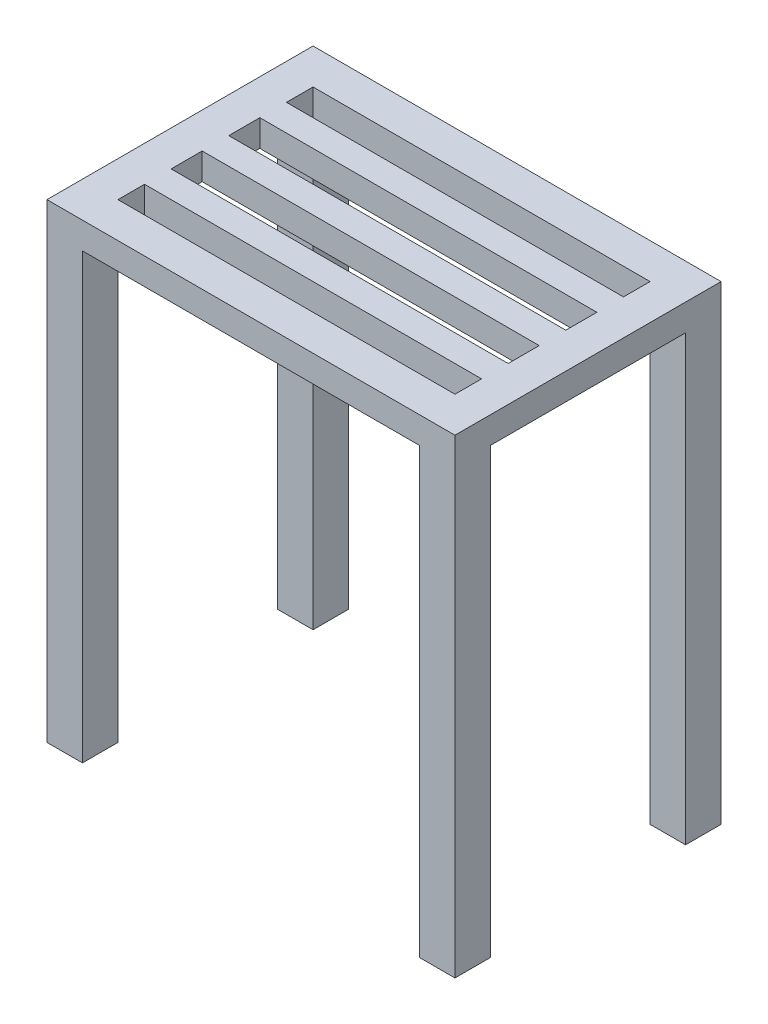
ISO-10303-21;
HEADER;
FILE_DESCRIPTION(('STEP AP214'),'2;1');
FILE_NAME('part.step','',(''),(''),'','','');
FILE_SCHEMA(('AUTOMOTIVE_DESIGN { 1 0 10303 214 1 1 1 1 }'));
ENDSEC;
DATA;
#1=APPLICATION_CONTEXT('core data for automotive mechanical design processes');
#2=APPLICATION_PROTOCOL_DEFINITION('international standard','automotive_design',2000,#1);
#3=PRODUCT_CONTEXT('',#1,'mechanical');
#4=PRODUCT('Part','Part','',(#3));
#5=PRODUCT_RELATED_PRODUCT_CATEGORY('part','',(#4));
#6=PRODUCT_DEFINITION_FORMATION('','',#4);
#7=PRODUCT_DEFINITION_CONTEXT('part definition',#1,'design');
#8=PRODUCT_DEFINITION('design','',#6,#7);
#9=PRODUCT_DEFINITION_SHAPE('','',#8);
#10=(LENGTH_UNIT() NAMED_UNIT(*) SI_UNIT(.MILLI.,.METRE.));
#11=(NAMED_UNIT(*) PLANE_ANGLE_UNIT() SI_UNIT($,.RADIAN.));
#12=(NAMED_UNIT(*) SI_UNIT($,.STERADIAN.) SOLID_ANGLE_UNIT());
#13=UNCERTAINTY_MEASURE_WITH_UNIT(LENGTH_MEASURE(1.E-05),#10,'distance_accuracy_value','');
#14=(GEOMETRIC_REPRESENTATION_CONTEXT(3) GLOBAL_UNCERTAINTY_ASSIGNED_CONTEXT((#13)) GLOBAL_UNIT_ASSIGNED_CONTEXT((#10,
#11,#12)) REPRESENTATION_CONTEXT('',''));
#15=CARTESIAN_POINT('',(0.,0.,0.));
#16=DIRECTION('',(0.,0.,1.));
#17=DIRECTION('',(1.,0.,0.));
#18=AXIS2_PLACEMENT_3D('',#15,#16,#17);
#19=CARTESIAN_POINT('',(-190.,530.,110.));
#20=DIRECTION('',(1.,0.,0.));
#21=DIRECTION('',(0.,0.,-1.));
#22=AXIS2_PLACEMENT_3D('',#19,#20,#21);
#23=PLANE('',#22);
#24=DIRECTION('',(0.,0.,1.));
#25=VECTOR('',#24,1.);
#26=CARTESIAN_POINT('',(-190.,530.,110.));
#27=LINE('',#26,#25);
#28=CARTESIAN_POINT('',(-190.,530.,-110.));
#29=VERTEX_POINT('',#28);
#30=CARTESIAN_POINT('',(-190.,530.,-80.));
#31=VERTEX_POINT('',#30);
#32=EDGE_CURVE('E248',#29,#31,#27,.T.);
#33=ORIENTED_EDGE('',*,*,#32,.T.);
#34=DIRECTION('',(0.,1.,0.));
#35=VECTOR('',#34,1.);
#36=CARTESIAN_POINT('',(-190.,530.,-79.9999999999999));
#37=LINE('',#36,#35);
#38=CARTESIAN_POINT('',(-190.,500.,-80.));
#39=VERTEX_POINT('',#38);
#40=EDGE_CURVE('E63',#39,#31,#37,.T.);
#41=ORIENTED_EDGE('',*,*,#40,.F.);
#42=DIRECTION('',(0.,0.,1.));
#43=VECTOR('',#42,1.);
#44=CARTESIAN_POINT('',(-190.,500.,110.));
#45=LINE('',#44,#43);
#46=CARTESIAN_POINT('',(-190.,500.,-110.));
#47=VERTEX_POINT('',#46);
#48=EDGE_CURVE('E455',#47,#39,#45,.T.);
#49=ORIENTED_EDGE('',*,*,#48,.F.);
#50=DIRECTION('',(0.,-1.,0.));
#51=VECTOR('',#50,1.);
#52=CARTESIAN_POINT('',(-190.,530.,-110.));
#53=LINE('',#52,#51);
#54=EDGE_CURVE('E454',#29,#47,#53,.T.);
#55=ORIENTED_EDGE('',*,*,#54,.F.);
#56=EDGE_LOOP('',(#33,#41,#49,#55));
#57=FACE_BOUND('',#56,.T.);
#58=ADVANCED_FACE('F39',(#57),#23,.T.);
#59=CARTESIAN_POINT('',(-190.,500.,-50.));
#60=VERTEX_POINT('',#59);
#61=CARTESIAN_POINT('',(-190.,500.,-15.));
#62=VERTEX_POINT('',#61);
#63=EDGE_CURVE('E55',#60,#62,#45,.T.);
#64=ORIENTED_EDGE('',*,*,#63,.F.);
#65=DIRECTION('',(0.,-1.,0.));
#66=VECTOR('',#65,1.);
#67=CARTESIAN_POINT('',(-190.,530.,-50.));
#68=LINE('',#67,#66);
#69=CARTESIAN_POINT('',(-190.,530.,-50.));
#70=VERTEX_POINT('',#69);
#71=EDGE_CURVE('E252',#70,#60,#68,.T.);
#72=ORIENTED_EDGE('',*,*,#71,.F.);
#73=CARTESIAN_POINT('',(-190.,530.,-15.));
#74=VERTEX_POINT('',#73);
#75=EDGE_CURVE('E239',#70,#74,#27,.T.);
#76=ORIENTED_EDGE('',*,*,#75,.T.);
#77=DIRECTION('',(0.,1.,0.));
#78=VECTOR('',#77,1.);
#79=CARTESIAN_POINT('',(-190.,530.,-15.));
#80=LINE('',#79,#78);
#81=EDGE_CURVE('E283',#62,#74,#80,.T.);
#82=ORIENTED_EDGE('',*,*,#81,.F.);
#83=EDGE_LOOP('',(#64,#72,#76,#82));
#84=FACE_BOUND('',#83,.T.);
#85=ADVANCED_FACE('F253',(#84),#23,.T.);
#86=CARTESIAN_POINT('',(190.,530.,-110.));
#87=DIRECTION('',(-1.,0.,0.));
#88=DIRECTION('',(0.,0.,1.));
#89=AXIS2_PLACEMENT_3D('',#86,#87,#88);
#90=PLANE('',#89);
#91=DIRECTION('',(0.,0.,-1.));
#92=VECTOR('',#91,1.);
#93=CARTESIAN_POINT('',(190.,500.,-110.));
#94=LINE('',#93,#92);
#95=CARTESIAN_POINT('',(190.,500.,-80.));
#96=VERTEX_POINT('',#95);
#97=CARTESIAN_POINT('',(190.,500.,-110.));
#98=VERTEX_POINT('',#97);
#99=EDGE_CURVE('E462',#96,#98,#94,.T.);
#100=ORIENTED_EDGE('',*,*,#99,.F.);
#101=DIRECTION('',(0.,-1.,0.));
#102=VECTOR('',#101,1.);
#103=CARTESIAN_POINT('',(190.,530.,-80.));
#104=LINE('',#103,#102);
#105=CARTESIAN_POINT('',(190.,530.,-80.));
#106=VERTEX_POINT('',#105);
#107=EDGE_CURVE('E272',#106,#96,#104,.T.);
#108=ORIENTED_EDGE('',*,*,#107,.F.);
#109=DIRECTION('',(0.,0.,-1.));
#110=VECTOR('',#109,1.);
#111=CARTESIAN_POINT('',(190.,530.,-110.));
#112=LINE('',#111,#110);
#113=CARTESIAN_POINT('',(190.,530.,-110.));
#114=VERTEX_POINT('',#113);
#115=EDGE_CURVE('E445',#106,#114,#112,.T.);
#116=ORIENTED_EDGE('',*,*,#115,.T.);
#117=DIRECTION('',(0.,-1.,0.));
#118=VECTOR('',#117,1.);
#119=CARTESIAN_POINT('',(190.,530.,-110.));
#120=LINE('',#119,#118);
#121=EDGE_CURVE('E475',#114,#98,#120,.T.);
#122=ORIENTED_EDGE('',*,*,#121,.T.);
#123=EDGE_LOOP('',(#100,#108,#116,#122));
#124=FACE_BOUND('',#123,.T.);
#125=ADVANCED_FACE('F681',(#124),#90,.T.);
#126=CARTESIAN_POINT('',(190.,530.,-15.0000000000001));
#127=VERTEX_POINT('',#126);
#128=CARTESIAN_POINT('',(190.,530.,-50.));
#129=VERTEX_POINT('',#128);
#130=EDGE_CURVE('E1021',#127,#129,#112,.T.);
#131=ORIENTED_EDGE('',*,*,#130,.T.);
#132=DIRECTION('',(0.,1.,0.));
#133=VECTOR('',#132,1.);
#134=CARTESIAN_POINT('',(190.,530.,-50.));
#135=LINE('',#134,#133);
#136=CARTESIAN_POINT('',(190.,500.,-50.));
#137=VERTEX_POINT('',#136);
#138=EDGE_CURVE('E260',#137,#129,#135,.T.);
#139=ORIENTED_EDGE('',*,*,#138,.F.);
#140=CARTESIAN_POINT('',(190.,500.,-15.0000000000001));
#141=VERTEX_POINT('',#140);
#142=EDGE_CURVE('E598',#141,#137,#94,.T.);
#143=ORIENTED_EDGE('',*,*,#142,.F.);
#144=DIRECTION('',(0.,-1.,0.));
#145=VECTOR('',#144,1.);
#146=CARTESIAN_POINT('',(190.,530.,-15.0000000000001));
#147=LINE('',#146,#145);
#148=EDGE_CURVE('E291',#127,#141,#147,.T.);
#149=ORIENTED_EDGE('',*,*,#148,.F.);
#150=EDGE_LOOP('',(#131,#139,#143,#149));
#151=FACE_BOUND('',#150,.T.);
#152=ADVANCED_FACE('F694',(#151),#90,.T.);
#153=CARTESIAN_POINT('',(-190.,500.,15.));
#154=VERTEX_POINT('',#153);
#155=CARTESIAN_POINT('',(-190.,500.,50.));
#156=VERTEX_POINT('',#155);
#157=EDGE_CURVE('E702',#154,#156,#45,.T.);
#158=ORIENTED_EDGE('',*,*,#157,.F.);
#159=DIRECTION('',(0.,-1.,0.));
#160=VECTOR('',#159,1.);
#161=CARTESIAN_POINT('',(-190.,530.,15.));
#162=LINE('',#161,#160);
#163=CARTESIAN_POINT('',(-190.,530.,15.));
#164=VERTEX_POINT('',#163);
#165=EDGE_CURVE('E279',#164,#154,#162,.T.);
#166=ORIENTED_EDGE('',*,*,#165,.F.);
#167=CARTESIAN_POINT('',(-190.,530.,50.));
#168=VERTEX_POINT('',#167);
#169=EDGE_CURVE('E249',#164,#168,#27,.T.);
#170=ORIENTED_EDGE('',*,*,#169,.T.);
#171=DIRECTION('',(0.,1.,0.));
#172=VECTOR('',#171,1.);
#173=CARTESIAN_POINT('',(-190.,530.,50.));
#174=LINE('',#173,#172);
#175=EDGE_CURVE('E311',#156,#168,#174,.T.);
#176=ORIENTED_EDGE('',*,*,#175,.F.);
#177=EDGE_LOOP('',(#158,#166,#170,#176));
#178=FACE_BOUND('',#177,.T.);
#179=ADVANCED_FACE('F682',(#178),#23,.T.);
#180=CARTESIAN_POINT('',(190.,530.,50.));
#181=VERTEX_POINT('',#180);
#182=CARTESIAN_POINT('',(190.,530.,14.9999999999999));
#183=VERTEX_POINT('',#182);
#184=EDGE_CURVE('E451',#181,#183,#112,.T.);
#185=ORIENTED_EDGE('',*,*,#184,.T.);
#186=DIRECTION('',(0.,1.,0.));
#187=VECTOR('',#186,1.);
#188=CARTESIAN_POINT('',(190.,530.,14.9999999999999));
#189=LINE('',#188,#187);
#190=CARTESIAN_POINT('',(190.,500.,14.9999999999999));
#191=VERTEX_POINT('',#190);
#192=EDGE_CURVE('E304',#191,#183,#189,.T.);
#193=ORIENTED_EDGE('',*,*,#192,.F.);
#194=CARTESIAN_POINT('',(190.,500.,49.9999999999999));
#195=VERTEX_POINT('',#194);
#196=EDGE_CURVE('E468',#195,#191,#94,.T.);
#197=ORIENTED_EDGE('',*,*,#196,.F.);
#198=DIRECTION('',(0.,-1.,0.));
#199=VECTOR('',#198,1.);
#200=CARTESIAN_POINT('',(190.,530.,50.));
#201=LINE('',#200,#199);
#202=EDGE_CURVE('E320',#181,#195,#201,.T.);
#203=ORIENTED_EDGE('',*,*,#202,.F.);
#204=EDGE_LOOP('',(#185,#193,#197,#203));
#205=FACE_BOUND('',#204,.T.);
#206=ADVANCED_FACE('F686',(#205),#90,.T.);
#207=CARTESIAN_POINT('',(-190.,500.,80.));
#208=VERTEX_POINT('',#207);
#209=CARTESIAN_POINT('',(-190.,500.,110.));
#210=VERTEX_POINT('',#209);
#211=EDGE_CURVE('E438',#208,#210,#45,.T.);
#212=ORIENTED_EDGE('',*,*,#211,.F.);
#213=DIRECTION('',(0.,-1.,0.));
#214=VECTOR('',#213,1.);
#215=CARTESIAN_POINT('',(-190.,530.,80.));
#216=LINE('',#215,#214);
#217=CARTESIAN_POINT('',(-190.,530.,80.));
#218=VERTEX_POINT('',#217);
#219=EDGE_CURVE('E308',#218,#208,#216,.T.);
#220=ORIENTED_EDGE('',*,*,#219,.F.);
#221=CARTESIAN_POINT('',(-190.,530.,110.));
#222=VERTEX_POINT('',#221);
#223=EDGE_CURVE('E442',#218,#222,#27,.T.);
#224=ORIENTED_EDGE('',*,*,#223,.T.);
#225=DIRECTION('',(0.,-1.,0.));
#226=VECTOR('',#225,1.);
#227=CARTESIAN_POINT('',(-190.,530.,110.));
#228=LINE('',#227,#226);
#229=EDGE_CURVE('E483',#222,#210,#228,.T.);
#230=ORIENTED_EDGE('',*,*,#229,.T.);
#231=EDGE_LOOP('',(#212,#220,#224,#230));
#232=FACE_BOUND('',#231,.T.);
#233=ADVANCED_FACE('F677',(#232),#23,.T.);
#234=CARTESIAN_POINT('',(190.,530.,110.));
#235=VERTEX_POINT('',#234);
#236=CARTESIAN_POINT('',(190.,530.,79.9999999999999));
#237=VERTEX_POINT('',#236);
#238=EDGE_CURVE('E446',#235,#237,#112,.T.);
#239=ORIENTED_EDGE('',*,*,#238,.T.);
#240=DIRECTION('',(0.,1.,0.));
#241=VECTOR('',#240,1.);
#242=CARTESIAN_POINT('',(190.,530.,79.9999999999999));
#243=LINE('',#242,#241);
#244=CARTESIAN_POINT('',(190.,500.,79.9999999999999));
#245=VERTEX_POINT('',#244);
#246=EDGE_CURVE('E334',#245,#237,#243,.T.);
#247=ORIENTED_EDGE('',*,*,#246,.F.);
#248=CARTESIAN_POINT('',(190.,500.,110.));
#249=VERTEX_POINT('',#248);
#250=EDGE_CURVE('E463',#249,#245,#94,.T.);
#251=ORIENTED_EDGE('',*,*,#250,.F.);
#252=DIRECTION('',(0.,-1.,0.));
#253=VECTOR('',#252,1.);
#254=CARTESIAN_POINT('',(190.,530.,110.));
#255=LINE('',#254,#253);
#256=EDGE_CURVE('E479',#235,#249,#255,.T.);
#257=ORIENTED_EDGE('',*,*,#256,.F.);
#258=EDGE_LOOP('',(#239,#247,#251,#257));
#259=FACE_BOUND('',#258,.T.);
#260=ADVANCED_FACE('F648',(#259),#90,.T.);
#261=CARTESIAN_POINT('',(0.,500.,0.));
#262=DIRECTION('',(0.,-1.,0.));
#263=DIRECTION('',(0.,0.,-1.));
#264=AXIS2_PLACEMENT_3D('',#261,#262,#263);
#265=PLANE('',#264);
#266=DIRECTION('',(-1.,0.,0.));
#267=VECTOR('',#266,1.);
#268=CARTESIAN_POINT('',(-230.,500.,-150.));
#269=LINE('',#268,#267);
#270=CARTESIAN_POINT('',(190.,500.,-150.));
#271=VERTEX_POINT('',#270);
#272=CARTESIAN_POINT('',(-190.,500.,-150.));
#273=VERTEX_POINT('',#272);
#274=EDGE_CURVE('E493',#271,#273,#269,.T.);
#275=ORIENTED_EDGE('',*,*,#274,.F.);
#276=DIRECTION('',(0.,0.,1.));
#277=VECTOR('',#276,1.);
#278=CARTESIAN_POINT('',(190.,500.,-150.));
#279=LINE('',#278,#277);
#280=EDGE_CURVE('E338',#271,#98,#279,.T.);
#281=ORIENTED_EDGE('',*,*,#280,.T.);
#282=DIRECTION('',(-1.,0.,0.));
#283=VECTOR('',#282,1.);
#284=CARTESIAN_POINT('',(-190.,500.,-110.));
#285=LINE('',#284,#283);
#286=EDGE_CURVE('E467',#98,#47,#285,.T.);
#287=ORIENTED_EDGE('',*,*,#286,.T.);
#288=DIRECTION('',(0.,0.,-1.));
#289=VECTOR('',#288,1.);
#290=CARTESIAN_POINT('',(-190.,500.,-150.));
#291=LINE('',#290,#289);
#292=EDGE_CURVE('E526',#47,#273,#291,.T.);
#293=ORIENTED_EDGE('',*,*,#292,.T.);
#294=EDGE_LOOP('',(#275,#281,#287,#293));
#295=FACE_BOUND('',#294,.T.);
#296=ADVANCED_FACE('F574',(#295),#265,.T.);
#297=DIRECTION('',(1.,0.,0.));
#298=VECTOR('',#297,1.);
#299=CARTESIAN_POINT('',(190.,500.,110.));
#300=LINE('',#299,#298);
#301=EDGE_CURVE('E458',#210,#249,#300,.T.);
#302=ORIENTED_EDGE('',*,*,#301,.T.);
#303=DIRECTION('',(0.,0.,1.));
#304=VECTOR('',#303,1.);
#305=CARTESIAN_POINT('',(190.,500.,150.));
#306=LINE('',#305,#304);
#307=CARTESIAN_POINT('',(190.,500.,150.));
#308=VERTEX_POINT('',#307);
#309=EDGE_CURVE('E376',#249,#308,#306,.T.);
#310=ORIENTED_EDGE('',*,*,#309,.T.);
#311=DIRECTION('',(1.,0.,0.));
#312=VECTOR('',#311,1.);
#313=CARTESIAN_POINT('',(230.,500.,150.));
#314=LINE('',#313,#312);
#315=CARTESIAN_POINT('',(-190.,500.,150.));
#316=VERTEX_POINT('',#315);
#317=EDGE_CURVE('E507',#316,#308,#314,.T.);
#318=ORIENTED_EDGE('',*,*,#317,.F.);
#319=DIRECTION('',(0.,0.,-1.));
#320=VECTOR('',#319,1.);
#321=CARTESIAN_POINT('',(-190.,500.,150.));
#322=LINE('',#321,#320);
#323=EDGE_CURVE('E406',#316,#210,#322,.T.);
#324=ORIENTED_EDGE('',*,*,#323,.T.);
#325=EDGE_LOOP('',(#302,#310,#318,#324));
#326=FACE_BOUND('',#325,.T.);
#327=ADVANCED_FACE('F650',(#326),#265,.T.);
#328=DIRECTION('',(-1.,0.,0.));
#329=VECTOR('',#328,1.);
#330=CARTESIAN_POINT('',(230.002,500.,-80.));
#331=LINE('',#330,#329);
#332=EDGE_CURVE('E267',#96,#39,#331,.T.);
#333=ORIENTED_EDGE('',*,*,#332,.F.);
#334=ORIENTED_EDGE('',*,*,#99,.T.);
#335=DIRECTION('',(1.,0.,0.));
#336=VECTOR('',#335,1.);
#337=CARTESIAN_POINT('',(230.,500.,-110.));
#338=LINE('',#337,#336);
#339=CARTESIAN_POINT('',(230.,500.,-110.));
#340=VERTEX_POINT('',#339);
#341=EDGE_CURVE('E342',#98,#340,#338,.T.);
#342=ORIENTED_EDGE('',*,*,#341,.T.);
#343=DIRECTION('',(0.,0.,-1.));
#344=VECTOR('',#343,1.);
#345=CARTESIAN_POINT('',(230.,500.,-150.));
#346=LINE('',#345,#344);
#347=CARTESIAN_POINT('',(230.,500.,110.));
#348=VERTEX_POINT('',#347);
#349=EDGE_CURVE('E511',#348,#340,#346,.T.);
#350=ORIENTED_EDGE('',*,*,#349,.F.);
#351=DIRECTION('',(-1.,0.,0.));
#352=VECTOR('',#351,1.);
#353=CARTESIAN_POINT('',(230.,500.,110.));
#354=LINE('',#353,#352);
#355=EDGE_CURVE('E372',#348,#249,#354,.T.);
#356=ORIENTED_EDGE('',*,*,#355,.T.);
#357=ORIENTED_EDGE('',*,*,#250,.T.);
#358=DIRECTION('',(-1.,0.,0.));
#359=VECTOR('',#358,1.);
#360=CARTESIAN_POINT('',(230.002,500.,79.9999999999999));
#361=LINE('',#360,#359);
#362=EDGE_CURVE('E316',#245,#208,#361,.T.);
#363=ORIENTED_EDGE('',*,*,#362,.T.);
#364=ORIENTED_EDGE('',*,*,#211,.T.);
#365=DIRECTION('',(-1.,0.,0.));
#366=VECTOR('',#365,1.);
#367=CARTESIAN_POINT('',(-230.,500.,110.));
#368=LINE('',#367,#366);
#369=CARTESIAN_POINT('',(-230.,500.,110.));
#370=VERTEX_POINT('',#369);
#371=EDGE_CURVE('E410',#210,#370,#368,.T.);
#372=ORIENTED_EDGE('',*,*,#371,.T.);
#373=DIRECTION('',(0.,0.,1.));
#374=VECTOR('',#373,1.);
#375=CARTESIAN_POINT('',(-230.,500.,150.));
#376=LINE('',#375,#374);
#377=CARTESIAN_POINT('',(-230.,500.,-110.));
#378=VERTEX_POINT('',#377);
#379=EDGE_CURVE('E487',#378,#370,#376,.T.);
#380=ORIENTED_EDGE('',*,*,#379,.F.);
#381=DIRECTION('',(1.,0.,0.));
#382=VECTOR('',#381,1.);
#383=CARTESIAN_POINT('',(-230.,500.,-110.));
#384=LINE('',#383,#382);
#385=EDGE_CURVE('E530',#378,#47,#384,.T.);
#386=ORIENTED_EDGE('',*,*,#385,.T.);
#387=ORIENTED_EDGE('',*,*,#48,.T.);
#388=EDGE_LOOP('',(#333,#334,#342,#350,#356,#357,#363,#364,#372,#380,#386,#387));
#389=FACE_BOUND('',#388,.T.);
#390=DIRECTION('',(-1.,0.,0.));
#391=VECTOR('',#390,1.);
#392=CARTESIAN_POINT('',(230.002,500.,-15.0000000000001));
#393=LINE('',#392,#391);
#394=EDGE_CURVE('E292',#141,#62,#393,.T.);
#395=ORIENTED_EDGE('',*,*,#394,.F.);
#396=ORIENTED_EDGE('',*,*,#142,.T.);
#397=DIRECTION('',(-1.,0.,0.));
#398=VECTOR('',#397,1.);
#399=CARTESIAN_POINT('',(230.002,500.,-50.));
#400=LINE('',#399,#398);
#401=EDGE_CURVE('E276',#137,#60,#400,.T.);
#402=ORIENTED_EDGE('',*,*,#401,.T.);
#403=ORIENTED_EDGE('',*,*,#63,.T.);
#404=EDGE_LOOP('',(#395,#396,#402,#403));
#405=FACE_BOUND('',#404,.T.);
#406=ORIENTED_EDGE('',*,*,#196,.T.);
#407=DIRECTION('',(-1.,0.,0.));
#408=VECTOR('',#407,1.);
#409=CARTESIAN_POINT('',(230.002,500.,14.9999999999999));
#410=LINE('',#409,#408);
#411=EDGE_CURVE('E287',#191,#154,#410,.T.);
#412=ORIENTED_EDGE('',*,*,#411,.T.);
#413=ORIENTED_EDGE('',*,*,#157,.T.);
#414=DIRECTION('',(-1.,0.,0.));
#415=VECTOR('',#414,1.);
#416=CARTESIAN_POINT('',(230.002,500.,49.9999999999999));
#417=LINE('',#416,#415);
#418=EDGE_CURVE('E321',#195,#156,#417,.T.);
#419=ORIENTED_EDGE('',*,*,#418,.F.);
#420=EDGE_LOOP('',(#406,#412,#413,#419));
#421=FACE_BOUND('',#420,.T.);
#422=ADVANCED_FACE('F596',(#389,#405,#421),#265,.T.);
#423=CARTESIAN_POINT('',(-190.,500.,-150.));
#424=DIRECTION('',(-1.,0.,0.));
#425=DIRECTION('',(0.,0.,1.));
#426=AXIS2_PLACEMENT_3D('',#423,#424,#425);
#427=PLANE('',#426);
#428=DIRECTION('',(0.,0.,-1.));
#429=VECTOR('',#428,1.);
#430=CARTESIAN_POINT('',(-190.,0.,-150.));
#431=LINE('',#430,#429);
#432=CARTESIAN_POINT('',(-190.,0.,-110.));
#433=VERTEX_POINT('',#432);
#434=CARTESIAN_POINT('',(-190.,0.,-150.));
#435=VERTEX_POINT('',#434);
#436=EDGE_CURVE('E525',#433,#435,#431,.T.);
#437=ORIENTED_EDGE('',*,*,#436,.T.);
#438=DIRECTION('',(0.,-1.,0.));
#439=VECTOR('',#438,1.);
#440=CARTESIAN_POINT('',(-190.,500.,-150.));
#441=LINE('',#440,#439);
#442=EDGE_CURVE('E11',#273,#435,#441,.T.);
#443=ORIENTED_EDGE('',*,*,#442,.F.);
#444=ORIENTED_EDGE('',*,*,#292,.F.);
#445=DIRECTION('',(0.,-1.,0.));
#446=VECTOR('',#445,1.);
#447=CARTESIAN_POINT('',(-190.,500.,-110.));
#448=LINE('',#447,#446);
#449=EDGE_CURVE('E535',#47,#433,#448,.T.);
#450=ORIENTED_EDGE('',*,*,#449,.T.);
#451=EDGE_LOOP('',(#437,#443,#444,#450));
#452=FACE_BOUND('',#451,.T.);
#453=ADVANCED_FACE('F41',(#452),#427,.F.);
#454=CARTESIAN_POINT('',(-230.,500.,-150.));
#455=DIRECTION('',(0.,0.,1.));
#456=DIRECTION('',(1.,0.,0.));
#457=AXIS2_PLACEMENT_3D('',#454,#455,#456);
#458=PLANE('',#457);
#459=DIRECTION('',(-1.,0.,0.));
#460=VECTOR('',#459,1.);
#461=CARTESIAN_POINT('',(-230.,0.,-150.));
#462=LINE('',#461,#460);
#463=CARTESIAN_POINT('',(-230.,0.,-150.));
#464=VERTEX_POINT('',#463);
#465=EDGE_CURVE('E539',#435,#464,#462,.T.);
#466=ORIENTED_EDGE('',*,*,#465,.T.);
#467=DIRECTION('',(0.,-1.,0.));
#468=VECTOR('',#467,1.);
#469=CARTESIAN_POINT('',(-230.,500.,-150.));
#470=LINE('',#469,#468);
#471=CARTESIAN_POINT('',(-230.,530.,-150.));
#472=VERTEX_POINT('',#471);
#473=EDGE_CURVE('E48',#472,#464,#470,.T.);
#474=ORIENTED_EDGE('',*,*,#473,.F.);
#475=DIRECTION('',(-1.,0.,0.));
#476=VECTOR('',#475,1.);
#477=CARTESIAN_POINT('',(-230.,530.,-150.));
#478=LINE('',#477,#476);
#479=CARTESIAN_POINT('',(230.,530.,-150.));
#480=VERTEX_POINT('',#479);
#481=EDGE_CURVE('E499',#480,#472,#478,.T.);
#482=ORIENTED_EDGE('',*,*,#481,.F.);
#483=DIRECTION('',(0.,-1.,0.));
#484=VECTOR('',#483,1.);
#485=CARTESIAN_POINT('',(230.,530.,-150.));
#486=LINE('',#485,#484);
#487=CARTESIAN_POINT('',(230.,0.,-150.));
#488=VERTEX_POINT('',#487);
#489=EDGE_CURVE('E503',#480,#488,#486,.T.);
#490=ORIENTED_EDGE('',*,*,#489,.T.);
#491=DIRECTION('',(-1.,0.,0.));
#492=VECTOR('',#491,1.);
#493=CARTESIAN_POINT('',(230.,0.,-150.));
#494=LINE('',#493,#492);
#495=CARTESIAN_POINT('',(190.,0.,-150.));
#496=VERTEX_POINT('',#495);
#497=EDGE_CURVE('E337',#488,#496,#494,.T.);
#498=ORIENTED_EDGE('',*,*,#497,.T.);
#499=DIRECTION('',(0.,-1.,0.));
#500=VECTOR('',#499,1.);
#501=CARTESIAN_POINT('',(190.,500.,-150.));
#502=LINE('',#501,#500);
#503=EDGE_CURVE('E367',#271,#496,#502,.T.);
#504=ORIENTED_EDGE('',*,*,#503,.F.);
#505=ORIENTED_EDGE('',*,*,#274,.T.);
#506=ORIENTED_EDGE('',*,*,#442,.T.);
#507=EDGE_LOOP('',(#466,#474,#482,#490,#498,#504,#505,#506));
#508=FACE_BOUND('',#507,.T.);
#509=ADVANCED_FACE('F622',(#508),#458,.F.);
#510=CARTESIAN_POINT('',(-230.,500.,-150.));
#511=DIRECTION('',(1.,0.,0.));
#512=DIRECTION('',(0.,0.,-1.));
#513=AXIS2_PLACEMENT_3D('',#510,#511,#512);
#514=PLANE('',#513);
#515=DIRECTION('',(0.,0.,1.));
#516=VECTOR('',#515,1.);
#517=CARTESIAN_POINT('',(-230.,0.,-150.));
#518=LINE('',#517,#516);
#519=CARTESIAN_POINT('',(-230.,0.,-110.));
#520=VERTEX_POINT('',#519);
#521=EDGE_CURVE('E542',#464,#520,#518,.T.);
#522=ORIENTED_EDGE('',*,*,#521,.T.);
#523=DIRECTION('',(0.,-1.,0.));
#524=VECTOR('',#523,1.);
#525=CARTESIAN_POINT('',(-230.,500.,-110.));
#526=LINE('',#525,#524);
#527=EDGE_CURVE('E550',#378,#520,#526,.T.);
#528=ORIENTED_EDGE('',*,*,#527,.F.);
#529=ORIENTED_EDGE('',*,*,#379,.T.);
#530=DIRECTION('',(0.,-1.,0.));
#531=VECTOR('',#530,1.);
#532=CARTESIAN_POINT('',(-230.,500.,110.));
#533=LINE('',#532,#531);
#534=CARTESIAN_POINT('',(-230.,0.,110.));
#535=VERTEX_POINT('',#534);
#536=EDGE_CURVE('E415',#370,#535,#533,.T.);
#537=ORIENTED_EDGE('',*,*,#536,.T.);
#538=DIRECTION('',(0.,0.,1.));
#539=VECTOR('',#538,1.);
#540=CARTESIAN_POINT('',(-230.,0.,150.));
#541=LINE('',#540,#539);
#542=CARTESIAN_POINT('',(-230.,0.,150.));
#543=VERTEX_POINT('',#542);
#544=EDGE_CURVE('E411',#535,#543,#541,.T.);
#545=ORIENTED_EDGE('',*,*,#544,.T.);
#546=DIRECTION('',(0.,-1.,0.));
#547=VECTOR('',#546,1.);
#548=CARTESIAN_POINT('',(-230.,530.,150.));
#549=LINE('',#548,#547);
#550=CARTESIAN_POINT('',(-230.,530.,150.));
#551=VERTEX_POINT('',#550);
#552=EDGE_CURVE('E522',#551,#543,#549,.T.);
#553=ORIENTED_EDGE('',*,*,#552,.F.);
#554=DIRECTION('',(0.,0.,1.));
#555=VECTOR('',#554,1.);
#556=CARTESIAN_POINT('',(-230.,530.,150.));
#557=LINE('',#556,#555);
#558=EDGE_CURVE('E488',#472,#551,#557,.T.);
#559=ORIENTED_EDGE('',*,*,#558,.F.);
#560=ORIENTED_EDGE('',*,*,#473,.T.);
#561=EDGE_LOOP('',(#522,#528,#529,#537,#545,#553,#559,#560));
#562=FACE_BOUND('',#561,.T.);
#563=ADVANCED_FACE('F558',(#562),#514,.F.);
#564=CARTESIAN_POINT('',(-230.,500.,-110.));
#565=DIRECTION('',(0.,0.,-1.));
#566=DIRECTION('',(-1.,0.,0.));
#567=AXIS2_PLACEMENT_3D('',#564,#565,#566);
#568=PLANE('',#567);
#569=DIRECTION('',(1.,0.,0.));
#570=VECTOR('',#569,1.);
#571=CARTESIAN_POINT('',(-230.,0.,-110.));
#572=LINE('',#571,#570);
#573=EDGE_CURVE('E531',#520,#433,#572,.T.);
#574=ORIENTED_EDGE('',*,*,#573,.T.);
#575=ORIENTED_EDGE('',*,*,#449,.F.);
#576=ORIENTED_EDGE('',*,*,#385,.F.);
#577=ORIENTED_EDGE('',*,*,#527,.T.);
#578=EDGE_LOOP('',(#574,#575,#576,#577));
#579=FACE_BOUND('',#578,.T.);
#580=ADVANCED_FACE('F568',(#579),#568,.F.);
#581=CARTESIAN_POINT('',(0.,0.,0.));
#582=DIRECTION('',(0.,1.,0.));
#583=DIRECTION('',(0.,0.,1.));
#584=AXIS2_PLACEMENT_3D('',#581,#582,#583);
#585=PLANE('',#584);
#586=ORIENTED_EDGE('',*,*,#436,.F.);
#587=ORIENTED_EDGE('',*,*,#573,.F.);
#588=ORIENTED_EDGE('',*,*,#521,.F.);
#589=ORIENTED_EDGE('',*,*,#465,.F.);
#590=EDGE_LOOP('',(#586,#587,#588,#589));
#591=FACE_BOUND('',#590,.T.);
#592=ADVANCED_FACE('F565',(#591),#585,.F.);
#593=CARTESIAN_POINT('',(0.,530.,0.));
#594=DIRECTION('',(0.,-1.,0.));
#595=DIRECTION('',(0.,0.,-1.));
#596=AXIS2_PLACEMENT_3D('',#593,#594,#595);
#597=PLANE('',#596);
#598=ORIENTED_EDGE('',*,*,#115,.F.);
#599=DIRECTION('',(-1.,0.,0.));
#600=VECTOR('',#599,1.);
#601=CARTESIAN_POINT('',(230.002,530.,-80.));
#602=LINE('',#601,#600);
#603=EDGE_CURVE('E262',#106,#31,#602,.T.);
#604=ORIENTED_EDGE('',*,*,#603,.T.);
#605=ORIENTED_EDGE('',*,*,#32,.F.);
#606=DIRECTION('',(-1.,0.,0.));
#607=VECTOR('',#606,1.);
#608=CARTESIAN_POINT('',(-190.,530.,-110.));
#609=LINE('',#608,#607);
#610=EDGE_CURVE('E450',#114,#29,#609,.T.);
#611=ORIENTED_EDGE('',*,*,#610,.F.);
#612=EDGE_LOOP('',(#598,#604,#605,#611));
#613=FACE_BOUND('',#612,.T.);
#614=ORIENTED_EDGE('',*,*,#130,.F.);
#615=DIRECTION('',(-1.,0.,0.));
#616=VECTOR('',#615,1.);
#617=CARTESIAN_POINT('',(230.002,530.,-15.0000000000001));
#618=LINE('',#617,#616);
#619=EDGE_CURVE('E245',#127,#74,#618,.T.);
#620=ORIENTED_EDGE('',*,*,#619,.T.);
#621=ORIENTED_EDGE('',*,*,#75,.F.);
#622=DIRECTION('',(-1.,0.,0.));
#623=VECTOR('',#622,1.);
#624=CARTESIAN_POINT('',(230.002,530.,-50.));
#625=LINE('',#624,#623);
#626=EDGE_CURVE('E243',#129,#70,#625,.T.);
#627=ORIENTED_EDGE('',*,*,#626,.F.);
#628=EDGE_LOOP('',(#614,#620,#621,#627));
#629=FACE_BOUND('',#628,.T.);
#630=ORIENTED_EDGE('',*,*,#223,.F.);
#631=DIRECTION('',(-1.,0.,0.));
#632=VECTOR('',#631,1.);
#633=CARTESIAN_POINT('',(230.002,530.,79.9999999999999));
#634=LINE('',#633,#632);
#635=EDGE_CURVE('E315',#237,#218,#634,.T.);
#636=ORIENTED_EDGE('',*,*,#635,.F.);
#637=ORIENTED_EDGE('',*,*,#238,.F.);
#638=DIRECTION('',(1.,0.,0.));
#639=VECTOR('',#638,1.);
#640=CARTESIAN_POINT('',(190.,530.,110.));
#641=LINE('',#640,#639);
#642=EDGE_CURVE('E441',#222,#235,#641,.T.);
#643=ORIENTED_EDGE('',*,*,#642,.F.);
#644=EDGE_LOOP('',(#630,#636,#637,#643));
#645=FACE_BOUND('',#644,.T.);
#646=ORIENTED_EDGE('',*,*,#558,.T.);
#647=DIRECTION('',(1.,0.,0.));
#648=VECTOR('',#647,1.);
#649=CARTESIAN_POINT('',(230.,530.,150.));
#650=LINE('',#649,#648);
#651=CARTESIAN_POINT('',(230.,530.,150.));
#652=VERTEX_POINT('',#651);
#653=EDGE_CURVE('E492',#551,#652,#650,.T.);
#654=ORIENTED_EDGE('',*,*,#653,.T.);
#655=DIRECTION('',(0.,0.,-1.));
#656=VECTOR('',#655,1.);
#657=CARTESIAN_POINT('',(230.,530.,-150.));
#658=LINE('',#657,#656);
#659=EDGE_CURVE('E496',#652,#480,#658,.T.);
#660=ORIENTED_EDGE('',*,*,#659,.T.);
#661=ORIENTED_EDGE('',*,*,#481,.T.);
#662=EDGE_LOOP('',(#646,#654,#660,#661));
#663=FACE_BOUND('',#662,.T.);
#664=DIRECTION('',(-1.,0.,0.));
#665=VECTOR('',#664,1.);
#666=CARTESIAN_POINT('',(230.002,530.,14.9999999999999));
#667=LINE('',#666,#665);
#668=EDGE_CURVE('E286',#183,#164,#667,.T.);
#669=ORIENTED_EDGE('',*,*,#668,.F.);
#670=ORIENTED_EDGE('',*,*,#184,.F.);
#671=DIRECTION('',(-1.,0.,0.));
#672=VECTOR('',#671,1.);
#673=CARTESIAN_POINT('',(230.002,530.,49.9999999999999));
#674=LINE('',#673,#672);
#675=EDGE_CURVE('E325',#181,#168,#674,.T.);
#676=ORIENTED_EDGE('',*,*,#675,.T.);
#677=ORIENTED_EDGE('',*,*,#169,.F.);
#678=EDGE_LOOP('',(#669,#670,#676,#677));
#679=FACE_BOUND('',#678,.T.);
#680=ADVANCED_FACE('F240',(#613,#629,#645,#663,#679),#597,.F.);
#681=CARTESIAN_POINT('',(230.,530.,150.));
#682=DIRECTION('',(0.,0.,-1.));
#683=DIRECTION('',(-1.,0.,0.));
#684=AXIS2_PLACEMENT_3D('',#681,#682,#683);
#685=PLANE('',#684);
#686=ORIENTED_EDGE('',*,*,#552,.T.);
#687=DIRECTION('',(1.,0.,0.));
#688=VECTOR('',#687,1.);
#689=CARTESIAN_POINT('',(-230.,0.,150.));
#690=LINE('',#689,#688);
#691=CARTESIAN_POINT('',(-190.,0.,150.));
#692=VERTEX_POINT('',#691);
#693=EDGE_CURVE('E405',#543,#692,#690,.T.);
#694=ORIENTED_EDGE('',*,*,#693,.T.);
#695=DIRECTION('',(0.,-1.,0.));
#696=VECTOR('',#695,1.);
#697=CARTESIAN_POINT('',(-190.,500.,150.));
#698=LINE('',#697,#696);
#699=EDGE_CURVE('E435',#316,#692,#698,.T.);
#700=ORIENTED_EDGE('',*,*,#699,.F.);
#701=ORIENTED_EDGE('',*,*,#317,.T.);
#702=DIRECTION('',(0.,-1.,0.));
#703=VECTOR('',#702,1.);
#704=CARTESIAN_POINT('',(190.,500.,150.));
#705=LINE('',#704,#703);
#706=CARTESIAN_POINT('',(190.,0.,150.));
#707=VERTEX_POINT('',#706);
#708=EDGE_CURVE('E381',#308,#707,#705,.T.);
#709=ORIENTED_EDGE('',*,*,#708,.T.);
#710=DIRECTION('',(1.,0.,0.));
#711=VECTOR('',#710,1.);
#712=CARTESIAN_POINT('',(230.,0.,150.));
#713=LINE('',#712,#711);
#714=CARTESIAN_POINT('',(230.,0.,150.));
#715=VERTEX_POINT('',#714);
#716=EDGE_CURVE('E377',#707,#715,#713,.T.);
#717=ORIENTED_EDGE('',*,*,#716,.T.);
#718=DIRECTION('',(0.,-1.,0.));
#719=VECTOR('',#718,1.);
#720=CARTESIAN_POINT('',(230.,530.,150.));
#721=LINE('',#720,#719);
#722=EDGE_CURVE('E519',#652,#715,#721,.T.);
#723=ORIENTED_EDGE('',*,*,#722,.F.);
#724=ORIENTED_EDGE('',*,*,#653,.F.);
#725=EDGE_LOOP('',(#686,#694,#700,#701,#709,#717,#723,#724));
#726=FACE_BOUND('',#725,.T.);
#727=ADVANCED_FACE('F628',(#726),#685,.F.);
#728=CARTESIAN_POINT('',(230.,530.,-150.));
#729=DIRECTION('',(-1.,0.,0.));
#730=DIRECTION('',(0.,0.,1.));
#731=AXIS2_PLACEMENT_3D('',#728,#729,#730);
#732=PLANE('',#731);
#733=ORIENTED_EDGE('',*,*,#722,.T.);
#734=DIRECTION('',(0.,0.,-1.));
#735=VECTOR('',#734,1.);
#736=CARTESIAN_POINT('',(230.,0.,150.));
#737=LINE('',#736,#735);
#738=CARTESIAN_POINT('',(230.,0.,110.));
#739=VERTEX_POINT('',#738);
#740=EDGE_CURVE('E371',#715,#739,#737,.T.);
#741=ORIENTED_EDGE('',*,*,#740,.T.);
#742=DIRECTION('',(0.,-1.,0.));
#743=VECTOR('',#742,1.);
#744=CARTESIAN_POINT('',(230.,500.,110.));
#745=LINE('',#744,#743);
#746=EDGE_CURVE('E401',#348,#739,#745,.T.);
#747=ORIENTED_EDGE('',*,*,#746,.F.);
#748=ORIENTED_EDGE('',*,*,#349,.T.);
#749=DIRECTION('',(0.,-1.,0.));
#750=VECTOR('',#749,1.);
#751=CARTESIAN_POINT('',(230.,500.,-110.));
#752=LINE('',#751,#750);
#753=CARTESIAN_POINT('',(230.,0.,-110.));
#754=VERTEX_POINT('',#753);
#755=EDGE_CURVE('E347',#340,#754,#752,.T.);
#756=ORIENTED_EDGE('',*,*,#755,.T.);
#757=DIRECTION('',(0.,0.,-1.));
#758=VECTOR('',#757,1.);
#759=CARTESIAN_POINT('',(230.,0.,-150.));
#760=LINE('',#759,#758);
#761=EDGE_CURVE('E343',#754,#488,#760,.T.);
#762=ORIENTED_EDGE('',*,*,#761,.T.);
#763=ORIENTED_EDGE('',*,*,#489,.F.);
#764=ORIENTED_EDGE('',*,*,#659,.F.);
#765=EDGE_LOOP('',(#733,#741,#747,#748,#756,#762,#763,#764));
#766=FACE_BOUND('',#765,.T.);
#767=ADVANCED_FACE('F617',(#766),#732,.F.);
#768=CARTESIAN_POINT('',(190.,530.,110.));
#769=DIRECTION('',(0.,0.,-1.));
#770=DIRECTION('',(-1.,0.,0.));
#771=AXIS2_PLACEMENT_3D('',#768,#769,#770);
#772=PLANE('',#771);
#773=ORIENTED_EDGE('',*,*,#301,.F.);
#774=ORIENTED_EDGE('',*,*,#229,.F.);
#775=ORIENTED_EDGE('',*,*,#642,.T.);
#776=ORIENTED_EDGE('',*,*,#256,.T.);
#777=EDGE_LOOP('',(#773,#774,#775,#776));
#778=FACE_BOUND('',#777,.T.);
#779=ADVANCED_FACE('F642',(#778),#772,.T.);
#780=CARTESIAN_POINT('',(-190.,530.,-110.));
#781=DIRECTION('',(0.,0.,1.));
#782=DIRECTION('',(1.,0.,0.));
#783=AXIS2_PLACEMENT_3D('',#780,#781,#782);
#784=PLANE('',#783);
#785=ORIENTED_EDGE('',*,*,#286,.F.);
#786=ORIENTED_EDGE('',*,*,#121,.F.);
#787=ORIENTED_EDGE('',*,*,#610,.T.);
#788=ORIENTED_EDGE('',*,*,#54,.T.);
#789=EDGE_LOOP('',(#785,#786,#787,#788));
#790=FACE_BOUND('',#789,.T.);
#791=ADVANCED_FACE('F578',(#790),#784,.T.);
#792=CARTESIAN_POINT('',(-190.,500.,150.));
#793=DIRECTION('',(-1.,0.,0.));
#794=DIRECTION('',(0.,0.,1.));
#795=AXIS2_PLACEMENT_3D('',#792,#793,#794);
#796=PLANE('',#795);
#797=DIRECTION('',(0.,0.,-1.));
#798=VECTOR('',#797,1.);
#799=CARTESIAN_POINT('',(-190.,0.,150.));
#800=LINE('',#799,#798);
#801=CARTESIAN_POINT('',(-190.,0.,110.));
#802=VERTEX_POINT('',#801);
#803=EDGE_CURVE('E419',#692,#802,#800,.T.);
#804=ORIENTED_EDGE('',*,*,#803,.T.);
#805=DIRECTION('',(0.,-1.,0.));
#806=VECTOR('',#805,1.);
#807=CARTESIAN_POINT('',(-190.,500.,110.));
#808=LINE('',#807,#806);
#809=EDGE_CURVE('E431',#210,#802,#808,.T.);
#810=ORIENTED_EDGE('',*,*,#809,.F.);
#811=ORIENTED_EDGE('',*,*,#323,.F.);
#812=ORIENTED_EDGE('',*,*,#699,.T.);
#813=EDGE_LOOP('',(#804,#810,#811,#812));
#814=FACE_BOUND('',#813,.T.);
#815=ADVANCED_FACE('F655',(#814),#796,.F.);
#816=CARTESIAN_POINT('',(-230.,500.,110.));
#817=DIRECTION('',(0.,0.,1.));
#818=DIRECTION('',(1.,0.,0.));
#819=AXIS2_PLACEMENT_3D('',#816,#817,#818);
#820=PLANE('',#819);
#821=DIRECTION('',(-1.,0.,0.));
#822=VECTOR('',#821,1.);
#823=CARTESIAN_POINT('',(-230.,0.,110.));
#824=LINE('',#823,#822);
#825=EDGE_CURVE('E422',#802,#535,#824,.T.);
#826=ORIENTED_EDGE('',*,*,#825,.T.);
#827=ORIENTED_EDGE('',*,*,#536,.F.);
#828=ORIENTED_EDGE('',*,*,#371,.F.);
#829=ORIENTED_EDGE('',*,*,#809,.T.);
#830=EDGE_LOOP('',(#826,#827,#828,#829));
#831=FACE_BOUND('',#830,.T.);
#832=ADVANCED_FACE('F659',(#831),#820,.F.);
#833=CARTESIAN_POINT('',(0.,0.,0.));
#834=DIRECTION('',(0.,1.,0.));
#835=DIRECTION('',(0.,0.,1.));
#836=AXIS2_PLACEMENT_3D('',#833,#834,#835);
#837=PLANE('',#836);
#838=ORIENTED_EDGE('',*,*,#693,.F.);
#839=ORIENTED_EDGE('',*,*,#544,.F.);
#840=ORIENTED_EDGE('',*,*,#825,.F.);
#841=ORIENTED_EDGE('',*,*,#803,.F.);
#842=EDGE_LOOP('',(#838,#839,#840,#841));
#843=FACE_BOUND('',#842,.T.);
#844=ADVANCED_FACE('F665',(#843),#837,.F.);
#845=CARTESIAN_POINT('',(230.,500.,110.));
#846=DIRECTION('',(0.,0.,1.));
#847=DIRECTION('',(1.,0.,0.));
#848=AXIS2_PLACEMENT_3D('',#845,#846,#847);
#849=PLANE('',#848);
#850=DIRECTION('',(-1.,0.,0.));
#851=VECTOR('',#850,1.);
#852=CARTESIAN_POINT('',(230.,0.,110.));
#853=LINE('',#852,#851);
#854=CARTESIAN_POINT('',(190.,0.,110.));
#855=VERTEX_POINT('',#854);
#856=EDGE_CURVE('E385',#739,#855,#853,.T.);
#857=ORIENTED_EDGE('',*,*,#856,.T.);
#858=DIRECTION('',(0.,-1.,0.));
#859=VECTOR('',#858,1.);
#860=CARTESIAN_POINT('',(190.,500.,110.));
#861=LINE('',#860,#859);
#862=EDGE_CURVE('E397',#249,#855,#861,.T.);
#863=ORIENTED_EDGE('',*,*,#862,.F.);
#864=ORIENTED_EDGE('',*,*,#355,.F.);
#865=ORIENTED_EDGE('',*,*,#746,.T.);
#866=EDGE_LOOP('',(#857,#863,#864,#865));
#867=FACE_BOUND('',#866,.T.);
#868=ADVANCED_FACE('F636',(#867),#849,.F.);
#869=CARTESIAN_POINT('',(190.,500.,150.));
#870=DIRECTION('',(1.,0.,0.));
#871=DIRECTION('',(0.,0.,-1.));
#872=AXIS2_PLACEMENT_3D('',#869,#870,#871);
#873=PLANE('',#872);
#874=DIRECTION('',(0.,0.,1.));
#875=VECTOR('',#874,1.);
#876=CARTESIAN_POINT('',(190.,0.,150.));
#877=LINE('',#876,#875);
#878=EDGE_CURVE('E388',#855,#707,#877,.T.);
#879=ORIENTED_EDGE('',*,*,#878,.T.);
#880=ORIENTED_EDGE('',*,*,#708,.F.);
#881=ORIENTED_EDGE('',*,*,#309,.F.);
#882=ORIENTED_EDGE('',*,*,#862,.T.);
#883=EDGE_LOOP('',(#879,#880,#881,#882));
#884=FACE_BOUND('',#883,.T.);
#885=ADVANCED_FACE('F672',(#884),#873,.F.);
#886=CARTESIAN_POINT('',(0.,0.,0.));
#887=DIRECTION('',(0.,1.,0.));
#888=DIRECTION('',(0.,0.,1.));
#889=AXIS2_PLACEMENT_3D('',#886,#887,#888);
#890=PLANE('',#889);
#891=ORIENTED_EDGE('',*,*,#740,.F.);
#892=ORIENTED_EDGE('',*,*,#716,.F.);
#893=ORIENTED_EDGE('',*,*,#878,.F.);
#894=ORIENTED_EDGE('',*,*,#856,.F.);
#895=EDGE_LOOP('',(#891,#892,#893,#894));
#896=FACE_BOUND('',#895,.T.);
#897=ADVANCED_FACE('F633',(#896),#890,.F.);
#898=CARTESIAN_POINT('',(190.,500.,-150.));
#899=DIRECTION('',(1.,0.,0.));
#900=DIRECTION('',(0.,0.,-1.));
#901=AXIS2_PLACEMENT_3D('',#898,#899,#900);
#902=PLANE('',#901);
#903=DIRECTION('',(0.,0.,1.));
#904=VECTOR('',#903,1.);
#905=CARTESIAN_POINT('',(190.,0.,-150.));
#906=LINE('',#905,#904);
#907=CARTESIAN_POINT('',(190.,0.,-110.));
#908=VERTEX_POINT('',#907);
#909=EDGE_CURVE('E351',#496,#908,#906,.T.);
#910=ORIENTED_EDGE('',*,*,#909,.T.);
#911=DIRECTION('',(0.,-1.,0.));
#912=VECTOR('',#911,1.);
#913=CARTESIAN_POINT('',(190.,500.,-110.));
#914=LINE('',#913,#912);
#915=EDGE_CURVE('E363',#98,#908,#914,.T.);
#916=ORIENTED_EDGE('',*,*,#915,.F.);
#917=ORIENTED_EDGE('',*,*,#280,.F.);
#918=ORIENTED_EDGE('',*,*,#503,.T.);
#919=EDGE_LOOP('',(#910,#916,#917,#918));
#920=FACE_BOUND('',#919,.T.);
#921=ADVANCED_FACE('F610',(#920),#902,.F.);
#922=CARTESIAN_POINT('',(230.,500.,-110.));
#923=DIRECTION('',(0.,0.,-1.));
#924=DIRECTION('',(-1.,0.,0.));
#925=AXIS2_PLACEMENT_3D('',#922,#923,#924);
#926=PLANE('',#925);
#927=DIRECTION('',(1.,0.,0.));
#928=VECTOR('',#927,1.);
#929=CARTESIAN_POINT('',(230.,0.,-110.));
#930=LINE('',#929,#928);
#931=EDGE_CURVE('E354',#908,#754,#930,.T.);
#932=ORIENTED_EDGE('',*,*,#931,.T.);
#933=ORIENTED_EDGE('',*,*,#755,.F.);
#934=ORIENTED_EDGE('',*,*,#341,.F.);
#935=ORIENTED_EDGE('',*,*,#915,.T.);
#936=EDGE_LOOP('',(#932,#933,#934,#935));
#937=FACE_BOUND('',#936,.T.);
#938=ADVANCED_FACE('F614',(#937),#926,.F.);
#939=CARTESIAN_POINT('',(0.,0.,0.));
#940=DIRECTION('',(0.,1.,0.));
#941=DIRECTION('',(0.,0.,1.));
#942=AXIS2_PLACEMENT_3D('',#939,#940,#941);
#943=PLANE('',#942);
#944=ORIENTED_EDGE('',*,*,#497,.F.);
#945=ORIENTED_EDGE('',*,*,#761,.F.);
#946=ORIENTED_EDGE('',*,*,#931,.F.);
#947=ORIENTED_EDGE('',*,*,#909,.F.);
#948=EDGE_LOOP('',(#944,#945,#946,#947));
#949=FACE_BOUND('',#948,.T.);
#950=ADVANCED_FACE('F621',(#949),#943,.F.);
#951=CARTESIAN_POINT('',(230.002,530.,49.9999999999999));
#952=DIRECTION('',(0.,0.,1.));
#953=DIRECTION('',(0.,-1.,0.));
#954=AXIS2_PLACEMENT_3D('',#951,#952,#953);
#955=PLANE('',#954);
#956=ORIENTED_EDGE('',*,*,#675,.F.);
#957=ORIENTED_EDGE('',*,*,#202,.T.);
#958=ORIENTED_EDGE('',*,*,#418,.T.);
#959=ORIENTED_EDGE('',*,*,#175,.T.);
#960=EDGE_LOOP('',(#956,#957,#958,#959));
#961=FACE_BOUND('',#960,.T.);
#962=ADVANCED_FACE('F721',(#961),#955,.F.);
#963=CARTESIAN_POINT('',(230.002,530.,79.9999999999999));
#964=DIRECTION('',(0.,0.,-1.));
#965=DIRECTION('',(-1.,0.,0.));
#966=AXIS2_PLACEMENT_3D('',#963,#964,#965);
#967=PLANE('',#966);
#968=ORIENTED_EDGE('',*,*,#362,.F.);
#969=ORIENTED_EDGE('',*,*,#246,.T.);
#970=ORIENTED_EDGE('',*,*,#635,.T.);
#971=ORIENTED_EDGE('',*,*,#219,.T.);
#972=EDGE_LOOP('',(#968,#969,#970,#971));
#973=FACE_BOUND('',#972,.T.);
#974=ADVANCED_FACE('F716',(#973),#967,.F.);
#975=CARTESIAN_POINT('',(230.002,530.,-15.0000000000001));
#976=DIRECTION('',(0.,0.,1.));
#977=DIRECTION('',(0.,-1.,0.));
#978=AXIS2_PLACEMENT_3D('',#975,#976,#977);
#979=PLANE('',#978);
#980=ORIENTED_EDGE('',*,*,#619,.F.);
#981=ORIENTED_EDGE('',*,*,#148,.T.);
#982=ORIENTED_EDGE('',*,*,#394,.T.);
#983=ORIENTED_EDGE('',*,*,#81,.T.);
#984=EDGE_LOOP('',(#980,#981,#982,#983));
#985=FACE_BOUND('',#984,.T.);
#986=ADVANCED_FACE('F720',(#985),#979,.F.);
#987=CARTESIAN_POINT('',(230.002,530.,14.9999999999999));
#988=DIRECTION('',(0.,0.,-1.));
#989=DIRECTION('',(0.,1.,0.));
#990=AXIS2_PLACEMENT_3D('',#987,#988,#989);
#991=PLANE('',#990);
#992=ORIENTED_EDGE('',*,*,#411,.F.);
#993=ORIENTED_EDGE('',*,*,#192,.T.);
#994=ORIENTED_EDGE('',*,*,#668,.T.);
#995=ORIENTED_EDGE('',*,*,#165,.T.);
#996=EDGE_LOOP('',(#992,#993,#994,#995));
#997=FACE_BOUND('',#996,.T.);
#998=ADVANCED_FACE('F707',(#997),#991,.F.);
#999=CARTESIAN_POINT('',(230.002,530.,-80.));
#1000=DIRECTION('',(0.,0.,1.));
#1001=DIRECTION('',(1.,0.,0.));
#1002=AXIS2_PLACEMENT_3D('',#999,#1000,#1001);
#1003=PLANE('',#1002);
#1004=ORIENTED_EDGE('',*,*,#603,.F.);
#1005=ORIENTED_EDGE('',*,*,#107,.T.);
#1006=ORIENTED_EDGE('',*,*,#332,.T.);
#1007=ORIENTED_EDGE('',*,*,#40,.T.);
#1008=EDGE_LOOP('',(#1004,#1005,#1006,#1007));
#1009=FACE_BOUND('',#1008,.T.);
#1010=ADVANCED_FACE('F587',(#1009),#1003,.F.);
#1011=CARTESIAN_POINT('',(230.002,530.,-50.));
#1012=DIRECTION('',(0.,0.,-1.));
#1013=DIRECTION('',(0.,1.,0.));
#1014=AXIS2_PLACEMENT_3D('',#1011,#1012,#1013);
#1015=PLANE('',#1014);
#1016=ORIENTED_EDGE('',*,*,#401,.F.);
#1017=ORIENTED_EDGE('',*,*,#138,.T.);
#1018=ORIENTED_EDGE('',*,*,#626,.T.);
#1019=ORIENTED_EDGE('',*,*,#71,.T.);
#1020=EDGE_LOOP('',(#1016,#1017,#1018,#1019));
#1021=FACE_BOUND('',#1020,.T.);
#1022=ADVANCED_FACE('F259',(#1021),#1015,.F.);
#1023=CLOSED_SHELL('',(#58,#85,#125,#152,#179,#206,#233,#260,#296,#327,#422,#453,#509,#563,#580,
#592,#680,#727,#767,#779,#791,#815,#832,#844,#868,#885,#897,#921,#938,#950,#962,#974,#986,#998,
#1010,#1022));
#1024=MANIFOLD_SOLID_BREP('B2',#1023);
#1025=ADVANCED_BREP_SHAPE_REPRESENTATION('',(#18,#1024),#14);
#1026=SHAPE_DEFINITION_REPRESENTATION(#9,#1025);
ENDSEC;
END-ISO-10303-21;
